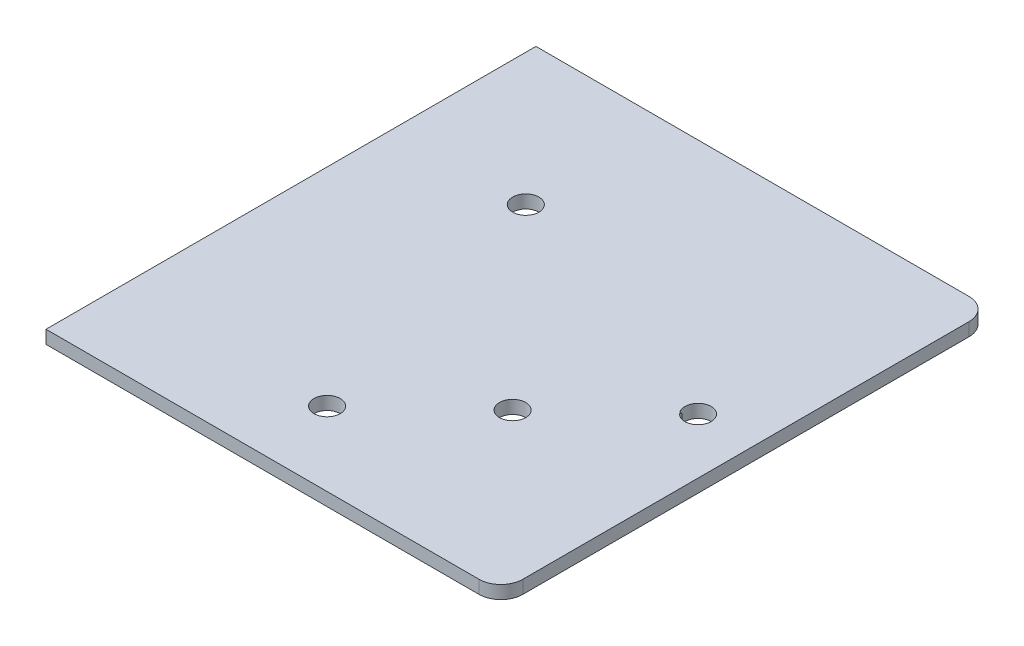
ISO-10303-21;
HEADER;
FILE_DESCRIPTION(('STEP AP214'),'2;1');
FILE_NAME('part.step','',(''),(''),'','','');
FILE_SCHEMA(('AUTOMOTIVE_DESIGN { 1 0 10303 214 1 1 1 1 }'));
ENDSEC;
DATA;
#1=APPLICATION_CONTEXT('core data for automotive mechanical design processes');
#2=APPLICATION_PROTOCOL_DEFINITION('international standard','automotive_design',2000,#1);
#3=PRODUCT_CONTEXT('',#1,'mechanical');
#4=PRODUCT('Part','Part','',(#3));
#5=PRODUCT_RELATED_PRODUCT_CATEGORY('part','',(#4));
#6=PRODUCT_DEFINITION_FORMATION('','',#4);
#7=PRODUCT_DEFINITION_CONTEXT('part definition',#1,'design');
#8=PRODUCT_DEFINITION('design','',#6,#7);
#9=PRODUCT_DEFINITION_SHAPE('','',#8);
#10=(LENGTH_UNIT() NAMED_UNIT(*) SI_UNIT(.MILLI.,.METRE.));
#11=(NAMED_UNIT(*) PLANE_ANGLE_UNIT() SI_UNIT($,.RADIAN.));
#12=(NAMED_UNIT(*) SI_UNIT($,.STERADIAN.) SOLID_ANGLE_UNIT());
#13=UNCERTAINTY_MEASURE_WITH_UNIT(LENGTH_MEASURE(1.E-05),#10,'distance_accuracy_value','');
#14=(GEOMETRIC_REPRESENTATION_CONTEXT(3) GLOBAL_UNCERTAINTY_ASSIGNED_CONTEXT((#13)) GLOBAL_UNIT_ASSIGNED_CONTEXT((#10,
#11,#12)) REPRESENTATION_CONTEXT('',''));
#15=CARTESIAN_POINT('',(0.,0.,0.));
#16=DIRECTION('',(0.,0.,1.));
#17=DIRECTION('',(1.,0.,0.));
#18=AXIS2_PLACEMENT_3D('',#15,#16,#17);
#19=CARTESIAN_POINT('',(-912.372794199772,9.525,0.));
#20=DIRECTION('',(0.,1.,0.));
#21=DIRECTION('',(0.,0.,1.));
#22=AXIS2_PLACEMENT_3D('',#19,#20,#21);
#23=PLANE('',#22);
#24=CARTESIAN_POINT('',(324.37624019523,9.525,-74.6563567128288));
#25=DIRECTION('',(0.,-1.,0.));
#26=DIRECTION('',(0.,0.,-1.));
#27=AXIS2_PLACEMENT_3D('',#24,#25,#26);
#28=CIRCLE('',#27,9.52500000000002);
#29=CARTESIAN_POINT('',(324.37624019523,9.525,-84.1813567128288));
#30=VERTEX_POINT('',#29);
#31=EDGE_CURVE('E330',#30,#30,#28,.T.);
#32=ORIENTED_EDGE('',*,*,#31,.T.);
#33=EDGE_LOOP('',(#32));
#34=FACE_BOUND('',#33,.T.);
#35=CARTESIAN_POINT('',(448.72901397876,9.525,59.2620150540493));
#36=DIRECTION('',(0.,-1.,0.));
#37=DIRECTION('',(0.,0.,-1.));
#38=AXIS2_PLACEMENT_3D('',#35,#36,#37);
#39=CIRCLE('',#38,9.52500000000002);
#40=CARTESIAN_POINT('',(448.72901397876,9.525,49.7370150540493));
#41=VERTEX_POINT('',#40);
#42=EDGE_CURVE('E132',#41,#41,#39,.T.);
#43=ORIENTED_EDGE('',*,*,#42,.T.);
#44=EDGE_LOOP('',(#43));
#45=FACE_BOUND('',#44,.T.);
#46=DIRECTION('',(1.,0.,0.));
#47=VECTOR('',#46,1.);
#48=CARTESIAN_POINT('',(-912.372794199772,9.525,177.8));
#49=LINE('',#48,#47);
#50=CARTESIAN_POINT('',(228.6,9.525,177.8));
#51=VERTEX_POINT('',#50);
#52=CARTESIAN_POINT('',(542.925,9.525,177.8));
#53=VERTEX_POINT('',#52);
#54=EDGE_CURVE('E144',#51,#53,#49,.T.);
#55=ORIENTED_EDGE('',*,*,#54,.T.);
#56=CARTESIAN_POINT('',(542.925,9.525,161.925));
#57=DIRECTION('',(0.,1.,0.));
#58=DIRECTION('',(0.,0.,1.));
#59=AXIS2_PLACEMENT_3D('',#56,#57,#58);
#60=CIRCLE('',#59,15.875);
#61=CARTESIAN_POINT('',(558.8,9.525,161.925));
#62=VERTEX_POINT('',#61);
#63=EDGE_CURVE('E45',#53,#62,#60,.T.);
#64=ORIENTED_EDGE('',*,*,#63,.T.);
#65=DIRECTION('',(0.,0.,-1.));
#66=VECTOR('',#65,1.);
#67=CARTESIAN_POINT('',(558.8,9.525,0.));
#68=LINE('',#67,#66);
#69=CARTESIAN_POINT('',(558.8,9.525,-161.925));
#70=VERTEX_POINT('',#69);
#71=EDGE_CURVE('E152',#62,#70,#68,.T.);
#72=ORIENTED_EDGE('',*,*,#71,.T.);
#73=CARTESIAN_POINT('',(542.925,9.525,-161.925));
#74=DIRECTION('',(0.,1.,0.));
#75=DIRECTION('',(0.,0.,1.));
#76=AXIS2_PLACEMENT_3D('',#73,#74,#75);
#77=CIRCLE('',#76,15.875);
#78=CARTESIAN_POINT('',(542.925,9.525,-177.8));
#79=VERTEX_POINT('',#78);
#80=EDGE_CURVE('E181',#70,#79,#77,.T.);
#81=ORIENTED_EDGE('',*,*,#80,.T.);
#82=DIRECTION('',(1.,0.,0.));
#83=VECTOR('',#82,1.);
#84=CARTESIAN_POINT('',(-912.372794199772,9.525,-177.8));
#85=LINE('',#84,#83);
#86=CARTESIAN_POINT('',(228.6,9.525,-177.8));
#87=VERTEX_POINT('',#86);
#88=EDGE_CURVE('E156',#87,#79,#85,.T.);
#89=ORIENTED_EDGE('',*,*,#88,.F.);
#90=DIRECTION('',(0.,0.,1.));
#91=VECTOR('',#90,1.);
#92=CARTESIAN_POINT('',(228.6,9.525,0.));
#93=LINE('',#92,#91);
#94=EDGE_CURVE('E150',#87,#51,#93,.T.);
#95=ORIENTED_EDGE('',*,*,#94,.T.);
#96=EDGE_LOOP('',(#55,#64,#72,#81,#89,#95));
#97=FACE_BOUND('',#96,.T.);
#98=CARTESIAN_POINT('',(378.930433901355,9.525,124.074982268783));
#99=DIRECTION('',(0.,-1.,0.));
#100=DIRECTION('',(0.,0.,-1.));
#101=AXIS2_PLACEMENT_3D('',#98,#99,#100);
#102=CIRCLE('',#101,9.52500000000002);
#103=CARTESIAN_POINT('',(378.930433901355,9.525,114.549982268783));
#104=VERTEX_POINT('',#103);
#105=EDGE_CURVE('E138',#104,#104,#102,.T.);
#106=ORIENTED_EDGE('',*,*,#105,.T.);
#107=EDGE_LOOP('',(#106));
#108=FACE_BOUND('',#107,.T.);
#109=DIRECTION('',(0.732793491626299,0.,-0.680451099367278));
#110=VECTOR('',#109,1.);
#111=CARTESIAN_POINT('',(637.006785554576,9.525,-115.567344266351));
#112=LINE('',#111,#110);
#113=CARTESIAN_POINT('',(511.547736048425,9.525,0.930344560789445));
#114=VERTEX_POINT('',#113);
#115=CARTESIAN_POINT('',(512.549645575429,9.525,0.));
#116=VERTEX_POINT('',#115);
#117=EDGE_CURVE('E52',#114,#116,#112,.T.);
#118=ORIENTED_EDGE('',*,*,#117,.T.);
#119=DIRECTION('',(1.,0.,0.));
#120=VECTOR('',#119,1.);
#121=CARTESIAN_POINT('',(393.7,9.525,0.));
#122=LINE('',#121,#120);
#123=CARTESIAN_POINT('',(510.787273965252,9.525,0.));
#124=VERTEX_POINT('',#123);
#125=EDGE_CURVE('E110',#124,#116,#122,.T.);
#126=ORIENTED_EDGE('',*,*,#125,.F.);
#127=CARTESIAN_POINT('',(518.527594056165,9.525,-5.55095216068392));
#128=DIRECTION('',(0.,-1.,0.));
#129=DIRECTION('',(0.,0.,-1.));
#130=AXIS2_PLACEMENT_3D('',#127,#128,#129);
#131=CIRCLE('',#130,9.52500000000002);
#132=EDGE_CURVE('E117',#124,#114,#131,.T.);
#133=ORIENTED_EDGE('',*,*,#132,.T.);
#134=EDGE_LOOP('',(#118,#126,#133));
#135=FACE_BOUND('',#134,.T.);
#136=ADVANCED_FACE('F37',(#34,#45,#97,#108,#135),#23,.T.);
#137=CARTESIAN_POINT('',(-912.372794199772,0.,0.));
#138=DIRECTION('',(0.,1.,0.));
#139=DIRECTION('',(0.,0.,1.));
#140=AXIS2_PLACEMENT_3D('',#137,#138,#139);
#141=PLANE('',#140);
#142=CARTESIAN_POINT('',(324.37624019523,0.,-74.6563567128288));
#143=DIRECTION('',(0.,-1.,0.));
#144=DIRECTION('',(0.,0.,-1.));
#145=AXIS2_PLACEMENT_3D('',#142,#143,#144);
#146=CIRCLE('',#145,9.52500000000002);
#147=CARTESIAN_POINT('',(324.37624019523,0.,-84.1813567128288));
#148=VERTEX_POINT('',#147);
#149=EDGE_CURVE('E333',#148,#148,#146,.T.);
#150=ORIENTED_EDGE('',*,*,#149,.F.);
#151=EDGE_LOOP('',(#150));
#152=FACE_BOUND('',#151,.T.);
#153=CARTESIAN_POINT('',(448.72901397876,0.,59.2620150540493));
#154=DIRECTION('',(0.,-1.,0.));
#155=DIRECTION('',(0.,0.,-1.));
#156=AXIS2_PLACEMENT_3D('',#153,#154,#155);
#157=CIRCLE('',#156,9.52500000000002);
#158=CARTESIAN_POINT('',(448.72901397876,0.,49.7370150540493));
#159=VERTEX_POINT('',#158);
#160=EDGE_CURVE('E127',#159,#159,#157,.T.);
#161=ORIENTED_EDGE('',*,*,#160,.F.);
#162=EDGE_LOOP('',(#161));
#163=FACE_BOUND('',#162,.T.);
#164=DIRECTION('',(0.,0.,-1.));
#165=VECTOR('',#164,1.);
#166=CARTESIAN_POINT('',(558.8,0.,0.));
#167=LINE('',#166,#165);
#168=CARTESIAN_POINT('',(558.8,0.,161.925));
#169=VERTEX_POINT('',#168);
#170=CARTESIAN_POINT('',(558.8,0.,-161.925));
#171=VERTEX_POINT('',#170);
#172=EDGE_CURVE('E161',#169,#171,#167,.T.);
#173=ORIENTED_EDGE('',*,*,#172,.F.);
#174=CARTESIAN_POINT('',(542.925,0.,161.925));
#175=DIRECTION('',(0.,1.,0.));
#176=DIRECTION('',(0.,0.,1.));
#177=AXIS2_PLACEMENT_3D('',#174,#175,#176);
#178=CIRCLE('',#177,15.875);
#179=CARTESIAN_POINT('',(542.925,0.,177.8));
#180=VERTEX_POINT('',#179);
#181=EDGE_CURVE('E177',#169,#180,#178,.F.);
#182=ORIENTED_EDGE('',*,*,#181,.T.);
#183=DIRECTION('',(1.,0.,0.));
#184=VECTOR('',#183,1.);
#185=CARTESIAN_POINT('',(-912.372794199772,0.,177.8));
#186=LINE('',#185,#184);
#187=CARTESIAN_POINT('',(228.6,0.,177.8));
#188=VERTEX_POINT('',#187);
#189=EDGE_CURVE('E141',#188,#180,#186,.T.);
#190=ORIENTED_EDGE('',*,*,#189,.F.);
#191=DIRECTION('',(0.,0.,1.));
#192=VECTOR('',#191,1.);
#193=CARTESIAN_POINT('',(228.6,0.,0.));
#194=LINE('',#193,#192);
#195=CARTESIAN_POINT('',(228.6,0.,-177.8));
#196=VERTEX_POINT('',#195);
#197=EDGE_CURVE('E147',#196,#188,#194,.T.);
#198=ORIENTED_EDGE('',*,*,#197,.F.);
#199=DIRECTION('',(1.,0.,0.));
#200=VECTOR('',#199,1.);
#201=CARTESIAN_POINT('',(-912.372794199772,0.,-177.8));
#202=LINE('',#201,#200);
#203=CARTESIAN_POINT('',(542.925,0.,-177.8));
#204=VERTEX_POINT('',#203);
#205=EDGE_CURVE('E153',#196,#204,#202,.T.);
#206=ORIENTED_EDGE('',*,*,#205,.T.);
#207=CARTESIAN_POINT('',(542.925,0.,-161.925));
#208=DIRECTION('',(0.,1.,0.));
#209=DIRECTION('',(0.,0.,1.));
#210=AXIS2_PLACEMENT_3D('',#207,#208,#209);
#211=CIRCLE('',#210,15.875);
#212=EDGE_CURVE('E175',#204,#171,#211,.F.);
#213=ORIENTED_EDGE('',*,*,#212,.T.);
#214=EDGE_LOOP('',(#173,#182,#190,#198,#206,#213));
#215=FACE_BOUND('',#214,.T.);
#216=CARTESIAN_POINT('',(378.930433901355,0.,124.074982268783));
#217=DIRECTION('',(0.,-1.,0.));
#218=DIRECTION('',(0.,0.,-1.));
#219=AXIS2_PLACEMENT_3D('',#216,#217,#218);
#220=CIRCLE('',#219,9.52500000000002);
#221=CARTESIAN_POINT('',(378.930433901355,0.,114.549982268783));
#222=VERTEX_POINT('',#221);
#223=EDGE_CURVE('E136',#222,#222,#220,.T.);
#224=ORIENTED_EDGE('',*,*,#223,.F.);
#225=EDGE_LOOP('',(#224));
#226=FACE_BOUND('',#225,.T.);
#227=DIRECTION('',(1.,0.,0.));
#228=VECTOR('',#227,1.);
#229=CARTESIAN_POINT('',(393.7,0.,0.));
#230=LINE('',#229,#228);
#231=CARTESIAN_POINT('',(510.787273965252,0.,0.));
#232=VERTEX_POINT('',#231);
#233=CARTESIAN_POINT('',(512.549645575429,0.,0.));
#234=VERTEX_POINT('',#233);
#235=EDGE_CURVE('E60',#232,#234,#230,.T.);
#236=ORIENTED_EDGE('',*,*,#235,.T.);
#237=DIRECTION('',(0.732793491626299,0.,-0.680451099367278));
#238=VECTOR('',#237,1.);
#239=CARTESIAN_POINT('',(637.006785554576,0.,-115.567344266351));
#240=LINE('',#239,#238);
#241=CARTESIAN_POINT('',(511.547736048425,0.,0.930344560789417));
#242=VERTEX_POINT('',#241);
#243=EDGE_CURVE('E121',#242,#234,#240,.T.);
#244=ORIENTED_EDGE('',*,*,#243,.F.);
#245=CARTESIAN_POINT('',(518.527594056165,0.,-5.55095216068392));
#246=DIRECTION('',(0.,-1.,0.));
#247=DIRECTION('',(0.,0.,-1.));
#248=AXIS2_PLACEMENT_3D('',#245,#246,#247);
#249=CIRCLE('',#248,9.52500000000002);
#250=EDGE_CURVE('E124',#232,#242,#249,.T.);
#251=ORIENTED_EDGE('',*,*,#250,.F.);
#252=EDGE_LOOP('',(#236,#244,#251));
#253=FACE_BOUND('',#252,.T.);
#254=ADVANCED_FACE('F198',(#152,#163,#215,#226,#253),#141,.F.);
#255=CARTESIAN_POINT('',(228.6,9.525,0.));
#256=DIRECTION('',(1.,0.,0.));
#257=DIRECTION('',(0.,0.,-1.));
#258=AXIS2_PLACEMENT_3D('',#255,#256,#257);
#259=PLANE('',#258);
#260=ORIENTED_EDGE('',*,*,#197,.T.);
#261=DIRECTION('',(0.,-1.,0.));
#262=VECTOR('',#261,1.);
#263=CARTESIAN_POINT('',(228.6,9.525,177.8));
#264=LINE('',#263,#262);
#265=EDGE_CURVE('E167',#51,#188,#264,.T.);
#266=ORIENTED_EDGE('',*,*,#265,.F.);
#267=ORIENTED_EDGE('',*,*,#94,.F.);
#268=DIRECTION('',(0.,-1.,0.));
#269=VECTOR('',#268,1.);
#270=CARTESIAN_POINT('',(228.6,9.525,-177.8));
#271=LINE('',#270,#269);
#272=EDGE_CURVE('E159',#87,#196,#271,.T.);
#273=ORIENTED_EDGE('',*,*,#272,.T.);
#274=EDGE_LOOP('',(#260,#266,#267,#273));
#275=FACE_BOUND('',#274,.T.);
#276=ADVANCED_FACE('F206',(#275),#259,.F.);
#277=CARTESIAN_POINT('',(558.8,9.525,0.));
#278=DIRECTION('',(-1.,0.,0.));
#279=DIRECTION('',(0.,0.,1.));
#280=AXIS2_PLACEMENT_3D('',#277,#278,#279);
#281=PLANE('',#280);
#282=ORIENTED_EDGE('',*,*,#71,.F.);
#283=DIRECTION('',(0.,-1.,0.));
#284=VECTOR('',#283,1.);
#285=CARTESIAN_POINT('',(558.8,9.525,161.925));
#286=LINE('',#285,#284);
#287=EDGE_CURVE('E172',#62,#169,#286,.T.);
#288=ORIENTED_EDGE('',*,*,#287,.T.);
#289=ORIENTED_EDGE('',*,*,#172,.T.);
#290=DIRECTION('',(0.,-1.,0.));
#291=VECTOR('',#290,1.);
#292=CARTESIAN_POINT('',(558.8,9.525,-161.925));
#293=LINE('',#292,#291);
#294=EDGE_CURVE('E170',#171,#70,#293,.F.);
#295=ORIENTED_EDGE('',*,*,#294,.T.);
#296=EDGE_LOOP('',(#282,#288,#289,#295));
#297=FACE_BOUND('',#296,.T.);
#298=ADVANCED_FACE('F192',(#297),#281,.F.);
#299=CARTESIAN_POINT('',(-912.372794199772,9.525,-177.8));
#300=DIRECTION('',(0.,0.,-1.));
#301=DIRECTION('',(-1.,0.,0.));
#302=AXIS2_PLACEMENT_3D('',#299,#300,#301);
#303=PLANE('',#302);
#304=ORIENTED_EDGE('',*,*,#88,.T.);
#305=DIRECTION('',(0.,-1.,0.));
#306=VECTOR('',#305,1.);
#307=CARTESIAN_POINT('',(542.925,0.,-177.8));
#308=LINE('',#307,#306);
#309=EDGE_CURVE('E11',#79,#204,#308,.T.);
#310=ORIENTED_EDGE('',*,*,#309,.T.);
#311=ORIENTED_EDGE('',*,*,#205,.F.);
#312=ORIENTED_EDGE('',*,*,#272,.F.);
#313=EDGE_LOOP('',(#304,#310,#311,#312));
#314=FACE_BOUND('',#313,.T.);
#315=ADVANCED_FACE('F210',(#314),#303,.T.);
#316=CARTESIAN_POINT('',(-912.372794199772,9.525,177.8));
#317=DIRECTION('',(0.,0.,-1.));
#318=DIRECTION('',(-1.,0.,0.));
#319=AXIS2_PLACEMENT_3D('',#316,#317,#318);
#320=PLANE('',#319);
#321=ORIENTED_EDGE('',*,*,#189,.T.);
#322=DIRECTION('',(0.,-1.,0.));
#323=VECTOR('',#322,1.);
#324=CARTESIAN_POINT('',(542.925,9.525,177.8));
#325=LINE('',#324,#323);
#326=EDGE_CURVE('E179',#180,#53,#325,.F.);
#327=ORIENTED_EDGE('',*,*,#326,.T.);
#328=ORIENTED_EDGE('',*,*,#54,.F.);
#329=ORIENTED_EDGE('',*,*,#265,.T.);
#330=EDGE_LOOP('',(#321,#327,#328,#329));
#331=FACE_BOUND('',#330,.T.);
#332=ADVANCED_FACE('F202',(#331),#320,.F.);
#333=CARTESIAN_POINT('',(542.925,9.525,161.925));
#334=DIRECTION('',(0.,-1.,0.));
#335=DIRECTION('',(0.,0.,-1.));
#336=AXIS2_PLACEMENT_3D('',#333,#334,#335);
#337=CYLINDRICAL_SURFACE('',#336,15.875);
#338=ORIENTED_EDGE('',*,*,#63,.F.);
#339=ORIENTED_EDGE('',*,*,#326,.F.);
#340=ORIENTED_EDGE('',*,*,#181,.F.);
#341=ORIENTED_EDGE('',*,*,#287,.F.);
#342=EDGE_LOOP('',(#338,#339,#340,#341));
#343=FACE_BOUND('',#342,.T.);
#344=ADVANCED_FACE('F195',(#343),#337,.T.);
#345=CARTESIAN_POINT('',(542.925,9.525,-161.925));
#346=DIRECTION('',(0.,1.,0.));
#347=DIRECTION('',(0.,0.,1.));
#348=AXIS2_PLACEMENT_3D('',#345,#346,#347);
#349=CYLINDRICAL_SURFACE('',#348,15.875);
#350=ORIENTED_EDGE('',*,*,#80,.F.);
#351=ORIENTED_EDGE('',*,*,#294,.F.);
#352=ORIENTED_EDGE('',*,*,#212,.F.);
#353=ORIENTED_EDGE('',*,*,#309,.F.);
#354=EDGE_LOOP('',(#350,#351,#352,#353));
#355=FACE_BOUND('',#354,.T.);
#356=ADVANCED_FACE('F39',(#355),#349,.T.);
#357=CARTESIAN_POINT('',(378.930433901355,9.525,124.074982268783));
#358=DIRECTION('',(0.,-1.,0.));
#359=DIRECTION('',(0.,0.,-1.));
#360=AXIS2_PLACEMENT_3D('',#357,#358,#359);
#361=CYLINDRICAL_SURFACE('',#360,9.52500000000002);
#362=CARTESIAN_POINT('',(378.930433901355,9.525,114.549982268783));
#363=CARTESIAN_POINT('',(378.930433901355,9.42578125,114.549982268783));
#364=CARTESIAN_POINT('',(378.930433901355,9.3265625,114.549982268783));
#365=CARTESIAN_POINT('',(378.930433901355,9.128125,114.549982268783));
#366=CARTESIAN_POINT('',(378.930433901355,9.02890625,114.549982268783));
#367=CARTESIAN_POINT('',(378.930433901355,8.83046875,114.549982268783));
#368=CARTESIAN_POINT('',(378.930433901355,8.73125,114.549982268783));
#369=CARTESIAN_POINT('',(378.930433901355,8.5328125,114.549982268783));
#370=CARTESIAN_POINT('',(378.930433901355,8.43359375,114.549982268783));
#371=CARTESIAN_POINT('',(378.930433901355,8.23515625,114.549982268783));
#372=CARTESIAN_POINT('',(378.930433901355,8.1359375,114.549982268783));
#373=CARTESIAN_POINT('',(378.930433901355,7.9375,114.549982268783));
#374=CARTESIAN_POINT('',(378.930433901355,7.83828125,114.549982268783));
#375=CARTESIAN_POINT('',(378.930433901355,7.63984375,114.549982268783));
#376=CARTESIAN_POINT('',(378.930433901355,7.540625,114.549982268783));
#377=CARTESIAN_POINT('',(378.930433901355,7.3421875,114.549982268783));
#378=CARTESIAN_POINT('',(378.930433901355,7.24296875,114.549982268783));
#379=CARTESIAN_POINT('',(378.930433901355,7.04453125,114.549982268783));
#380=CARTESIAN_POINT('',(378.930433901355,6.9453125,114.549982268783));
#381=CARTESIAN_POINT('',(378.930433901355,6.746875,114.549982268783));
#382=CARTESIAN_POINT('',(378.930433901355,6.64765625,114.549982268783));
#383=CARTESIAN_POINT('',(378.930433901355,6.44921875,114.549982268783));
#384=CARTESIAN_POINT('',(378.930433901355,6.35,114.549982268783));
#385=CARTESIAN_POINT('',(378.930433901355,6.1515625,114.549982268783));
#386=CARTESIAN_POINT('',(378.930433901355,6.05234375,114.549982268783));
#387=CARTESIAN_POINT('',(378.930433901355,5.85390625,114.549982268783));
#388=CARTESIAN_POINT('',(378.930433901355,5.7546875,114.549982268783));
#389=CARTESIAN_POINT('',(378.930433901355,5.55625,114.549982268783));
#390=CARTESIAN_POINT('',(378.930433901355,5.45703125,114.549982268783));
#391=CARTESIAN_POINT('',(378.930433901355,5.25859375,114.549982268783));
#392=CARTESIAN_POINT('',(378.930433901355,5.159375,114.549982268783));
#393=CARTESIAN_POINT('',(378.930433901355,4.9609375,114.549982268783));
#394=CARTESIAN_POINT('',(378.930433901355,4.86171875,114.549982268783));
#395=CARTESIAN_POINT('',(378.930433901355,4.66328125,114.549982268783));
#396=CARTESIAN_POINT('',(378.930433901355,4.5640625,114.549982268783));
#397=CARTESIAN_POINT('',(378.930433901355,4.365625,114.549982268783));
#398=CARTESIAN_POINT('',(378.930433901355,4.26640625,114.549982268783));
#399=CARTESIAN_POINT('',(378.930433901355,4.06796875,114.549982268783));
#400=CARTESIAN_POINT('',(378.930433901355,3.96875,114.549982268783));
#401=CARTESIAN_POINT('',(378.930433901355,3.7703125,114.549982268783));
#402=CARTESIAN_POINT('',(378.930433901355,3.67109375,114.549982268783));
#403=CARTESIAN_POINT('',(378.930433901355,3.47265625,114.549982268783));
#404=CARTESIAN_POINT('',(378.930433901355,3.3734375,114.549982268783));
#405=CARTESIAN_POINT('',(378.930433901355,3.175,114.549982268783));
#406=CARTESIAN_POINT('',(378.930433901355,3.07578125,114.549982268783));
#407=CARTESIAN_POINT('',(378.930433901355,2.87734375,114.549982268783));
#408=CARTESIAN_POINT('',(378.930433901355,2.778125,114.549982268783));
#409=CARTESIAN_POINT('',(378.930433901355,2.5796875,114.549982268783));
#410=CARTESIAN_POINT('',(378.930433901355,2.48046875,114.549982268783));
#411=CARTESIAN_POINT('',(378.930433901355,2.28203125,114.549982268783));
#412=CARTESIAN_POINT('',(378.930433901355,2.1828125,114.549982268783));
#413=CARTESIAN_POINT('',(378.930433901355,1.984375,114.549982268783));
#414=CARTESIAN_POINT('',(378.930433901355,1.88515625,114.549982268783));
#415=CARTESIAN_POINT('',(378.930433901355,1.68671875,114.549982268783));
#416=CARTESIAN_POINT('',(378.930433901355,1.5875,114.549982268783));
#417=CARTESIAN_POINT('',(378.930433901355,1.3890625,114.549982268783));
#418=CARTESIAN_POINT('',(378.930433901355,1.28984375,114.549982268783));
#419=CARTESIAN_POINT('',(378.930433901355,1.09140625,114.549982268783));
#420=CARTESIAN_POINT('',(378.930433901355,0.992187500000001,114.549982268783));
#421=CARTESIAN_POINT('',(378.930433901355,0.793750000000001,114.549982268783));
#422=CARTESIAN_POINT('',(378.930433901355,0.69453125,114.549982268783));
#423=CARTESIAN_POINT('',(378.930433901355,0.49609375,114.549982268783));
#424=CARTESIAN_POINT('',(378.930433901355,0.396875,114.549982268783));
#425=CARTESIAN_POINT('',(378.930433901355,0.1984375,114.549982268783));
#426=CARTESIAN_POINT('',(378.930433901355,0.0992187500000001,114.549982268783));
#427=CARTESIAN_POINT('',(378.930433901355,0.,114.549982268783));
#428=B_SPLINE_CURVE_WITH_KNOTS('',3,(#362,#363,#364,#365,#366,#367,#368,#369,#370,#371,#372,
#373,#374,#375,#376,#377,#378,#379,#380,#381,#382,#383,#384,#385,#386,#387,#388,#389,#390,#391,
#392,#393,#394,#395,#396,#397,#398,#399,#400,#401,#402,#403,#404,#405,#406,#407,#408,#409,#410,
#411,#412,#413,#414,#415,#416,#417,#418,#419,#420,#421,#422,#423,#424,#425,#426,#427),
.UNSPECIFIED.,.F.,.F.,(4,2,2,2,2,2,2,2,2,2,2,2,2,2,2,2,2,2,2,2,2,2,2,2,2,2,2,2,2,2,2,2,4),(0.,
0.29765625,0.5953125,0.892968750000001,1.190625,1.48828125,1.7859375,2.08359375,2.38125,
2.67890625,2.9765625,3.27421875,3.571875,3.86953125,4.1671875,4.46484375,4.7625,5.06015625,
5.3578125,5.65546875,5.953125,6.25078125,6.5484375,6.84609375,7.14375,7.44140625,7.7390625,
8.03671875,8.334375,8.63203125,8.9296875,9.22734375,9.525),.UNSPECIFIED.);
#429=EDGE_CURVE('BSEAM214',#104,#222,#428,.T.);
#430=ORIENTED_EDGE('',*,*,#105,.F.);
#431=ORIENTED_EDGE('',*,*,#223,.T.);
#432=ORIENTED_EDGE('',*,*,#429,.T.);
#433=ORIENTED_EDGE('',*,*,#429,.F.);
#434=EDGE_LOOP('',(#430,#432,#431,#433));
#435=FACE_BOUND('',#434,.T.);
#436=ADVANCED_FACE('F214',(#435),#361,.F.);
#437=CARTESIAN_POINT('',(393.7,9.525,0.));
#438=DIRECTION('',(0.,0.,-1.));
#439=DIRECTION('',(-1.,0.,0.));
#440=AXIS2_PLACEMENT_3D('',#437,#438,#439);
#441=PLANE('',#440);
#442=ORIENTED_EDGE('',*,*,#235,.F.);
#443=DIRECTION('',(0.,-1.,0.));
#444=VECTOR('',#443,1.);
#445=CARTESIAN_POINT('',(510.787273965252,9.525,0.));
#446=LINE('',#445,#444);
#447=EDGE_CURVE('E106',#124,#232,#446,.T.);
#448=ORIENTED_EDGE('',*,*,#447,.F.);
#449=ORIENTED_EDGE('',*,*,#125,.T.);
#450=DIRECTION('',(0.,-1.,0.));
#451=VECTOR('',#450,1.);
#452=CARTESIAN_POINT('',(512.549645575429,9.525,0.));
#453=LINE('',#452,#451);
#454=EDGE_CURVE('E134',#116,#234,#453,.T.);
#455=ORIENTED_EDGE('',*,*,#454,.T.);
#456=EDGE_LOOP('',(#442,#448,#449,#455));
#457=FACE_BOUND('',#456,.T.);
#458=ADVANCED_FACE('F108',(#457),#441,.T.);
#459=CARTESIAN_POINT('',(637.006785554576,9.525,-115.567344266351));
#460=DIRECTION('',(-0.680451099367278,0.,-0.732793491626299));
#461=DIRECTION('',(-0.732793491626299,0.,0.680451099367278));
#462=AXIS2_PLACEMENT_3D('',#459,#460,#461);
#463=PLANE('',#462);
#464=ORIENTED_EDGE('',*,*,#243,.T.);
#465=ORIENTED_EDGE('',*,*,#454,.F.);
#466=ORIENTED_EDGE('',*,*,#117,.F.);
#467=DIRECTION('',(0.,-1.,0.));
#468=VECTOR('',#467,1.);
#469=CARTESIAN_POINT('',(511.547736048425,9.525,0.930344560789417));
#470=LINE('',#469,#468);
#471=EDGE_CURVE('E114',#114,#242,#470,.T.);
#472=ORIENTED_EDGE('',*,*,#471,.T.);
#473=EDGE_LOOP('',(#464,#465,#466,#472));
#474=FACE_BOUND('',#473,.T.);
#475=ADVANCED_FACE('F288',(#474),#463,.F.);
#476=CARTESIAN_POINT('',(518.527594056165,9.525,-5.55095216068392));
#477=DIRECTION('',(0.,-1.,0.));
#478=DIRECTION('',(0.,0.,-1.));
#479=AXIS2_PLACEMENT_3D('',#476,#477,#478);
#480=CYLINDRICAL_SURFACE('',#479,9.52500000000002);
#481=ORIENTED_EDGE('',*,*,#250,.T.);
#482=ORIENTED_EDGE('',*,*,#471,.F.);
#483=ORIENTED_EDGE('',*,*,#132,.F.);
#484=ORIENTED_EDGE('',*,*,#447,.T.);
#485=EDGE_LOOP('',(#481,#482,#483,#484));
#486=FACE_BOUND('',#485,.T.);
#487=ADVANCED_FACE('F118',(#486),#480,.F.);
#488=CARTESIAN_POINT('',(448.72901397876,9.525,59.2620150540493));
#489=DIRECTION('',(0.,-1.,0.));
#490=DIRECTION('',(0.,0.,-1.));
#491=AXIS2_PLACEMENT_3D('',#488,#489,#490);
#492=CYLINDRICAL_SURFACE('',#491,9.52500000000002);
#493=CARTESIAN_POINT('',(448.72901397876,9.525,49.7370150540493));
#494=CARTESIAN_POINT('',(448.72901397876,9.42578125,49.7370150540493));
#495=CARTESIAN_POINT('',(448.72901397876,9.3265625,49.7370150540493));
#496=CARTESIAN_POINT('',(448.72901397876,9.128125,49.7370150540493));
#497=CARTESIAN_POINT('',(448.72901397876,9.02890625,49.7370150540493));
#498=CARTESIAN_POINT('',(448.72901397876,8.83046875,49.7370150540493));
#499=CARTESIAN_POINT('',(448.72901397876,8.73125,49.7370150540493));
#500=CARTESIAN_POINT('',(448.72901397876,8.5328125,49.7370150540493));
#501=CARTESIAN_POINT('',(448.72901397876,8.43359375,49.7370150540493));
#502=CARTESIAN_POINT('',(448.72901397876,8.23515625,49.7370150540493));
#503=CARTESIAN_POINT('',(448.72901397876,8.1359375,49.7370150540493));
#504=CARTESIAN_POINT('',(448.72901397876,7.9375,49.7370150540493));
#505=CARTESIAN_POINT('',(448.72901397876,7.83828125,49.7370150540493));
#506=CARTESIAN_POINT('',(448.72901397876,7.63984375,49.7370150540493));
#507=CARTESIAN_POINT('',(448.72901397876,7.540625,49.7370150540493));
#508=CARTESIAN_POINT('',(448.72901397876,7.3421875,49.7370150540493));
#509=CARTESIAN_POINT('',(448.72901397876,7.24296875,49.7370150540493));
#510=CARTESIAN_POINT('',(448.72901397876,7.04453125,49.7370150540493));
#511=CARTESIAN_POINT('',(448.72901397876,6.9453125,49.7370150540493));
#512=CARTESIAN_POINT('',(448.72901397876,6.746875,49.7370150540493));
#513=CARTESIAN_POINT('',(448.72901397876,6.64765625,49.7370150540493));
#514=CARTESIAN_POINT('',(448.72901397876,6.44921875,49.7370150540493));
#515=CARTESIAN_POINT('',(448.72901397876,6.35,49.7370150540493));
#516=CARTESIAN_POINT('',(448.72901397876,6.1515625,49.7370150540493));
#517=CARTESIAN_POINT('',(448.72901397876,6.05234375,49.7370150540493));
#518=CARTESIAN_POINT('',(448.72901397876,5.85390625,49.7370150540493));
#519=CARTESIAN_POINT('',(448.72901397876,5.7546875,49.7370150540493));
#520=CARTESIAN_POINT('',(448.72901397876,5.55625,49.7370150540493));
#521=CARTESIAN_POINT('',(448.72901397876,5.45703125,49.7370150540493));
#522=CARTESIAN_POINT('',(448.72901397876,5.25859375,49.7370150540493));
#523=CARTESIAN_POINT('',(448.72901397876,5.159375,49.7370150540493));
#524=CARTESIAN_POINT('',(448.72901397876,4.9609375,49.7370150540493));
#525=CARTESIAN_POINT('',(448.72901397876,4.86171875,49.7370150540493));
#526=CARTESIAN_POINT('',(448.72901397876,4.66328125,49.7370150540493));
#527=CARTESIAN_POINT('',(448.72901397876,4.5640625,49.7370150540493));
#528=CARTESIAN_POINT('',(448.72901397876,4.365625,49.7370150540493));
#529=CARTESIAN_POINT('',(448.72901397876,4.26640625,49.7370150540493));
#530=CARTESIAN_POINT('',(448.72901397876,4.06796875,49.7370150540493));
#531=CARTESIAN_POINT('',(448.72901397876,3.96875,49.7370150540493));
#532=CARTESIAN_POINT('',(448.72901397876,3.7703125,49.7370150540493));
#533=CARTESIAN_POINT('',(448.72901397876,3.67109375,49.7370150540493));
#534=CARTESIAN_POINT('',(448.72901397876,3.47265625,49.7370150540493));
#535=CARTESIAN_POINT('',(448.72901397876,3.3734375,49.7370150540493));
#536=CARTESIAN_POINT('',(448.72901397876,3.175,49.7370150540493));
#537=CARTESIAN_POINT('',(448.72901397876,3.07578125,49.7370150540493));
#538=CARTESIAN_POINT('',(448.72901397876,2.87734375,49.7370150540493));
#539=CARTESIAN_POINT('',(448.72901397876,2.778125,49.7370150540493));
#540=CARTESIAN_POINT('',(448.72901397876,2.5796875,49.7370150540493));
#541=CARTESIAN_POINT('',(448.72901397876,2.48046875,49.7370150540493));
#542=CARTESIAN_POINT('',(448.72901397876,2.28203125,49.7370150540493));
#543=CARTESIAN_POINT('',(448.72901397876,2.1828125,49.7370150540493));
#544=CARTESIAN_POINT('',(448.72901397876,1.984375,49.7370150540493));
#545=CARTESIAN_POINT('',(448.72901397876,1.88515625,49.7370150540493));
#546=CARTESIAN_POINT('',(448.72901397876,1.68671875,49.7370150540493));
#547=CARTESIAN_POINT('',(448.72901397876,1.5875,49.7370150540493));
#548=CARTESIAN_POINT('',(448.72901397876,1.3890625,49.7370150540493));
#549=CARTESIAN_POINT('',(448.72901397876,1.28984375,49.7370150540493));
#550=CARTESIAN_POINT('',(448.72901397876,1.09140625,49.7370150540493));
#551=CARTESIAN_POINT('',(448.72901397876,0.992187500000001,49.7370150540493));
#552=CARTESIAN_POINT('',(448.72901397876,0.793750000000001,49.7370150540493));
#553=CARTESIAN_POINT('',(448.72901397876,0.69453125,49.7370150540493));
#554=CARTESIAN_POINT('',(448.72901397876,0.49609375,49.7370150540493));
#555=CARTESIAN_POINT('',(448.72901397876,0.396875,49.7370150540493));
#556=CARTESIAN_POINT('',(448.72901397876,0.1984375,49.7370150540493));
#557=CARTESIAN_POINT('',(448.72901397876,0.0992187500000001,49.7370150540493));
#558=CARTESIAN_POINT('',(448.72901397876,0.,49.7370150540493));
#559=B_SPLINE_CURVE_WITH_KNOTS('',3,(#493,#494,#495,#496,#497,#498,#499,#500,#501,#502,#503,
#504,#505,#506,#507,#508,#509,#510,#511,#512,#513,#514,#515,#516,#517,#518,#519,#520,#521,#522,
#523,#524,#525,#526,#527,#528,#529,#530,#531,#532,#533,#534,#535,#536,#537,#538,#539,#540,#541,
#542,#543,#544,#545,#546,#547,#548,#549,#550,#551,#552,#553,#554,#555,#556,#557,#558),
.UNSPECIFIED.,.F.,.F.,(4,2,2,2,2,2,2,2,2,2,2,2,2,2,2,2,2,2,2,2,2,2,2,2,2,2,2,2,2,2,2,2,4),(0.,
0.29765625,0.5953125,0.892968750000001,1.190625,1.48828125,1.7859375,2.08359375,2.38125,
2.67890625,2.9765625,3.27421875,3.571875,3.86953125,4.1671875,4.46484375,4.7625,5.06015625,
5.3578125,5.65546875,5.953125,6.25078125,6.5484375,6.84609375,7.14375,7.44140625,7.7390625,
8.03671875,8.334375,8.63203125,8.9296875,9.22734375,9.525),.UNSPECIFIED.);
#560=EDGE_CURVE('BSEAM305',#41,#159,#559,.T.);
#561=ORIENTED_EDGE('',*,*,#42,.F.);
#562=ORIENTED_EDGE('',*,*,#160,.T.);
#563=ORIENTED_EDGE('',*,*,#560,.T.);
#564=ORIENTED_EDGE('',*,*,#560,.F.);
#565=EDGE_LOOP('',(#561,#563,#562,#564));
#566=FACE_BOUND('',#565,.T.);
#567=ADVANCED_FACE('F305',(#566),#492,.F.);
#568=CARTESIAN_POINT('',(324.37624019523,9.525,-74.6563567128288));
#569=DIRECTION('',(0.,-1.,0.));
#570=DIRECTION('',(0.,0.,-1.));
#571=AXIS2_PLACEMENT_3D('',#568,#569,#570);
#572=CYLINDRICAL_SURFACE('',#571,9.52500000000002);
#573=CARTESIAN_POINT('',(324.37624019523,9.525,-84.1813567128288));
#574=CARTESIAN_POINT('',(324.37624019523,9.42578125,-84.1813567128288));
#575=CARTESIAN_POINT('',(324.37624019523,9.3265625,-84.1813567128288));
#576=CARTESIAN_POINT('',(324.37624019523,9.128125,-84.1813567128288));
#577=CARTESIAN_POINT('',(324.37624019523,9.02890625,-84.1813567128288));
#578=CARTESIAN_POINT('',(324.37624019523,8.83046875,-84.1813567128288));
#579=CARTESIAN_POINT('',(324.37624019523,8.73125,-84.1813567128288));
#580=CARTESIAN_POINT('',(324.37624019523,8.5328125,-84.1813567128288));
#581=CARTESIAN_POINT('',(324.37624019523,8.43359375,-84.1813567128288));
#582=CARTESIAN_POINT('',(324.37624019523,8.23515625,-84.1813567128288));
#583=CARTESIAN_POINT('',(324.37624019523,8.1359375,-84.1813567128288));
#584=CARTESIAN_POINT('',(324.37624019523,7.9375,-84.1813567128288));
#585=CARTESIAN_POINT('',(324.37624019523,7.83828125,-84.1813567128288));
#586=CARTESIAN_POINT('',(324.37624019523,7.63984375,-84.1813567128288));
#587=CARTESIAN_POINT('',(324.37624019523,7.540625,-84.1813567128288));
#588=CARTESIAN_POINT('',(324.37624019523,7.3421875,-84.1813567128288));
#589=CARTESIAN_POINT('',(324.37624019523,7.24296875,-84.1813567128288));
#590=CARTESIAN_POINT('',(324.37624019523,7.04453125,-84.1813567128288));
#591=CARTESIAN_POINT('',(324.37624019523,6.9453125,-84.1813567128288));
#592=CARTESIAN_POINT('',(324.37624019523,6.746875,-84.1813567128288));
#593=CARTESIAN_POINT('',(324.37624019523,6.64765625,-84.1813567128288));
#594=CARTESIAN_POINT('',(324.37624019523,6.44921875,-84.1813567128288));
#595=CARTESIAN_POINT('',(324.37624019523,6.35,-84.1813567128288));
#596=CARTESIAN_POINT('',(324.37624019523,6.1515625,-84.1813567128288));
#597=CARTESIAN_POINT('',(324.37624019523,6.05234375,-84.1813567128288));
#598=CARTESIAN_POINT('',(324.37624019523,5.85390625,-84.1813567128288));
#599=CARTESIAN_POINT('',(324.37624019523,5.7546875,-84.1813567128288));
#600=CARTESIAN_POINT('',(324.37624019523,5.55625,-84.1813567128288));
#601=CARTESIAN_POINT('',(324.37624019523,5.45703125,-84.1813567128288));
#602=CARTESIAN_POINT('',(324.37624019523,5.25859375,-84.1813567128288));
#603=CARTESIAN_POINT('',(324.37624019523,5.159375,-84.1813567128288));
#604=CARTESIAN_POINT('',(324.37624019523,4.9609375,-84.1813567128288));
#605=CARTESIAN_POINT('',(324.37624019523,4.86171875,-84.1813567128288));
#606=CARTESIAN_POINT('',(324.37624019523,4.66328125,-84.1813567128288));
#607=CARTESIAN_POINT('',(324.37624019523,4.5640625,-84.1813567128288));
#608=CARTESIAN_POINT('',(324.37624019523,4.365625,-84.1813567128288));
#609=CARTESIAN_POINT('',(324.37624019523,4.26640625,-84.1813567128288));
#610=CARTESIAN_POINT('',(324.37624019523,4.06796875,-84.1813567128288));
#611=CARTESIAN_POINT('',(324.37624019523,3.96875,-84.1813567128288));
#612=CARTESIAN_POINT('',(324.37624019523,3.7703125,-84.1813567128288));
#613=CARTESIAN_POINT('',(324.37624019523,3.67109375,-84.1813567128288));
#614=CARTESIAN_POINT('',(324.37624019523,3.47265625,-84.1813567128288));
#615=CARTESIAN_POINT('',(324.37624019523,3.3734375,-84.1813567128288));
#616=CARTESIAN_POINT('',(324.37624019523,3.175,-84.1813567128288));
#617=CARTESIAN_POINT('',(324.37624019523,3.07578125,-84.1813567128288));
#618=CARTESIAN_POINT('',(324.37624019523,2.87734375,-84.1813567128288));
#619=CARTESIAN_POINT('',(324.37624019523,2.778125,-84.1813567128288));
#620=CARTESIAN_POINT('',(324.37624019523,2.5796875,-84.1813567128288));
#621=CARTESIAN_POINT('',(324.37624019523,2.48046875,-84.1813567128288));
#622=CARTESIAN_POINT('',(324.37624019523,2.28203125,-84.1813567128288));
#623=CARTESIAN_POINT('',(324.37624019523,2.1828125,-84.1813567128288));
#624=CARTESIAN_POINT('',(324.37624019523,1.984375,-84.1813567128288));
#625=CARTESIAN_POINT('',(324.37624019523,1.88515625,-84.1813567128288));
#626=CARTESIAN_POINT('',(324.37624019523,1.68671875,-84.1813567128288));
#627=CARTESIAN_POINT('',(324.37624019523,1.5875,-84.1813567128288));
#628=CARTESIAN_POINT('',(324.37624019523,1.3890625,-84.1813567128288));
#629=CARTESIAN_POINT('',(324.37624019523,1.28984375,-84.1813567128288));
#630=CARTESIAN_POINT('',(324.37624019523,1.09140625,-84.1813567128288));
#631=CARTESIAN_POINT('',(324.37624019523,0.992187500000001,-84.1813567128288));
#632=CARTESIAN_POINT('',(324.37624019523,0.793750000000001,-84.1813567128288));
#633=CARTESIAN_POINT('',(324.37624019523,0.69453125,-84.1813567128288));
#634=CARTESIAN_POINT('',(324.37624019523,0.49609375,-84.1813567128288));
#635=CARTESIAN_POINT('',(324.37624019523,0.396875,-84.1813567128288));
#636=CARTESIAN_POINT('',(324.37624019523,0.1984375,-84.1813567128288));
#637=CARTESIAN_POINT('',(324.37624019523,0.0992187500000001,-84.1813567128288));
#638=CARTESIAN_POINT('',(324.37624019523,0.,-84.1813567128288));
#639=B_SPLINE_CURVE_WITH_KNOTS('',3,(#573,#574,#575,#576,#577,#578,#579,#580,#581,#582,#583,
#584,#585,#586,#587,#588,#589,#590,#591,#592,#593,#594,#595,#596,#597,#598,#599,#600,#601,#602,
#603,#604,#605,#606,#607,#608,#609,#610,#611,#612,#613,#614,#615,#616,#617,#618,#619,#620,#621,
#622,#623,#624,#625,#626,#627,#628,#629,#630,#631,#632,#633,#634,#635,#636,#637,#638),
.UNSPECIFIED.,.F.,.F.,(4,2,2,2,2,2,2,2,2,2,2,2,2,2,2,2,2,2,2,2,2,2,2,2,2,2,2,2,2,2,2,2,4),(0.,
0.29765625,0.5953125,0.892968750000001,1.190625,1.48828125,1.7859375,2.08359375,2.38125,
2.67890625,2.9765625,3.27421875,3.571875,3.86953125,4.1671875,4.46484375,4.7625,5.06015625,
5.3578125,5.65546875,5.953125,6.25078125,6.5484375,6.84609375,7.14375,7.44140625,7.7390625,
8.03671875,8.334375,8.63203125,8.9296875,9.22734375,9.525),.UNSPECIFIED.);
#640=EDGE_CURVE('BSEAM314',#30,#148,#639,.T.);
#641=ORIENTED_EDGE('',*,*,#31,.F.);
#642=ORIENTED_EDGE('',*,*,#149,.T.);
#643=ORIENTED_EDGE('',*,*,#640,.T.);
#644=ORIENTED_EDGE('',*,*,#640,.F.);
#645=EDGE_LOOP('',(#641,#643,#642,#644));
#646=FACE_BOUND('',#645,.T.);
#647=ADVANCED_FACE('F314',(#646),#572,.F.);
#648=CLOSED_SHELL('',(#136,#254,#276,#298,#315,#332,#344,#356,#436,#458,#475,#487,#567,#647));
#649=MANIFOLD_SOLID_BREP('B2',#648);
#650=ADVANCED_BREP_SHAPE_REPRESENTATION('',(#18,#649),#14);
#651=SHAPE_DEFINITION_REPRESENTATION(#9,#650);
ENDSEC;
END-ISO-10303-21;
